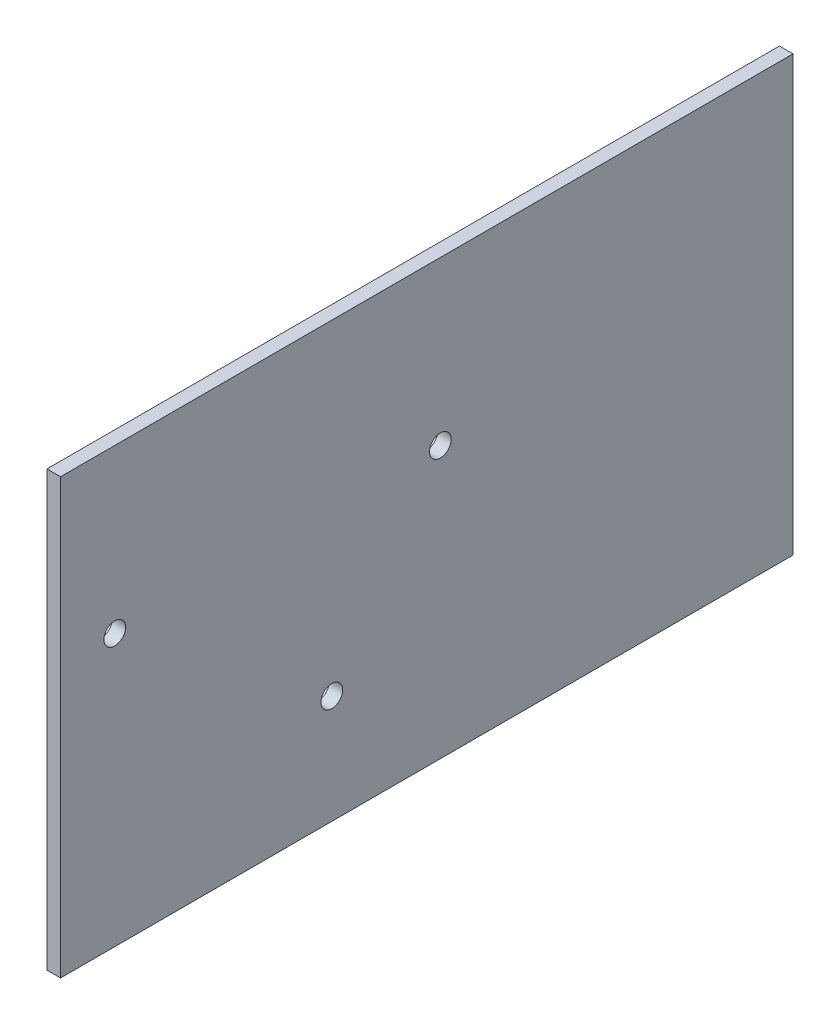
ISO-10303-21;
HEADER;
FILE_DESCRIPTION(('STEP AP214'),'2;1');
FILE_NAME('part.step','',(''),(''),'','','');
FILE_SCHEMA(('AUTOMOTIVE_DESIGN { 1 0 10303 214 1 1 1 1 }'));
ENDSEC;
DATA;
#1=APPLICATION_CONTEXT('core data for automotive mechanical design processes');
#2=APPLICATION_PROTOCOL_DEFINITION('international standard','automotive_design',2000,#1);
#3=PRODUCT_CONTEXT('',#1,'mechanical');
#4=PRODUCT('Part','Part','',(#3));
#5=PRODUCT_RELATED_PRODUCT_CATEGORY('part','',(#4));
#6=PRODUCT_DEFINITION_FORMATION('','',#4);
#7=PRODUCT_DEFINITION_CONTEXT('part definition',#1,'design');
#8=PRODUCT_DEFINITION('design','',#6,#7);
#9=PRODUCT_DEFINITION_SHAPE('','',#8);
#10=(LENGTH_UNIT() NAMED_UNIT(*) SI_UNIT(.MILLI.,.METRE.));
#11=(NAMED_UNIT(*) PLANE_ANGLE_UNIT() SI_UNIT($,.RADIAN.));
#12=(NAMED_UNIT(*) SI_UNIT($,.STERADIAN.) SOLID_ANGLE_UNIT());
#13=UNCERTAINTY_MEASURE_WITH_UNIT(LENGTH_MEASURE(1.E-05),#10,'distance_accuracy_value','');
#14=(GEOMETRIC_REPRESENTATION_CONTEXT(3) GLOBAL_UNCERTAINTY_ASSIGNED_CONTEXT((#13)) GLOBAL_UNIT_ASSIGNED_CONTEXT((#10,
#11,#12)) REPRESENTATION_CONTEXT('',''));
#15=CARTESIAN_POINT('',(0.,0.,0.));
#16=DIRECTION('',(0.,0.,1.));
#17=DIRECTION('',(1.,0.,0.));
#18=AXIS2_PLACEMENT_3D('',#15,#16,#17);
#19=CARTESIAN_POINT('',(-3.175,99.9099731913091,70.2838353243732));
#20=DIRECTION('',(0.,0.,1.));
#21=DIRECTION('',(0.,-1.,0.));
#22=AXIS2_PLACEMENT_3D('',#19,#20,#21);
#23=PLANE('',#22);
#24=DIRECTION('',(0.,-1.,0.));
#25=VECTOR('',#24,1.);
#26=CARTESIAN_POINT('',(0.,99.9099731913091,70.2838353243732));
#27=LINE('',#26,#25);
#28=CARTESIAN_POINT('',(0.,99.9099731913091,70.2838353243732));
#29=VERTEX_POINT('',#28);
#30=CARTESIAN_POINT('',(0.,-1.69002680869093,70.2838353243731));
#31=VERTEX_POINT('',#30);
#32=EDGE_CURVE('E98',#29,#31,#27,.T.);
#33=ORIENTED_EDGE('',*,*,#32,.F.);
#34=DIRECTION('',(1.,0.,0.));
#35=VECTOR('',#34,1.);
#36=CARTESIAN_POINT('',(-3.175,99.9099731913091,70.2838353243732));
#37=LINE('',#36,#35);
#38=CARTESIAN_POINT('',(-3.175,99.9099731913091,70.2838353243732));
#39=VERTEX_POINT('',#38);
#40=EDGE_CURVE('E11',#39,#29,#37,.T.);
#41=ORIENTED_EDGE('',*,*,#40,.F.);
#42=DIRECTION('',(0.,-1.,0.));
#43=VECTOR('',#42,1.);
#44=CARTESIAN_POINT('',(-3.175,99.9099731913091,70.2838353243732));
#45=LINE('',#44,#43);
#46=CARTESIAN_POINT('',(-3.175,-1.69002680869093,70.2838353243731));
#47=VERTEX_POINT('',#46);
#48=EDGE_CURVE('E91',#39,#47,#45,.T.);
#49=ORIENTED_EDGE('',*,*,#48,.T.);
#50=DIRECTION('',(1.,0.,0.));
#51=VECTOR('',#50,1.);
#52=CARTESIAN_POINT('',(-3.175,-1.69002680869093,70.2838353243731));
#53=LINE('',#52,#51);
#54=EDGE_CURVE('E36',#47,#31,#53,.T.);
#55=ORIENTED_EDGE('',*,*,#54,.T.);
#56=EDGE_LOOP('',(#33,#41,#49,#55));
#57=FACE_BOUND('',#56,.T.);
#58=ADVANCED_FACE('F33',(#57),#23,.T.);
#59=CARTESIAN_POINT('',(-3.175,99.9099731913091,70.2838353243732));
#60=DIRECTION('',(0.,1.,0.));
#61=DIRECTION('',(0.,0.,1.));
#62=AXIS2_PLACEMENT_3D('',#59,#60,#61);
#63=PLANE('',#62);
#64=DIRECTION('',(0.,0.,1.));
#65=VECTOR('',#64,1.);
#66=CARTESIAN_POINT('',(0.,99.9099731913091,70.2838353243732));
#67=LINE('',#66,#65);
#68=CARTESIAN_POINT('',(0.,99.9099731913091,-101.166164675627));
#69=VERTEX_POINT('',#68);
#70=EDGE_CURVE('E93',#69,#29,#67,.T.);
#71=ORIENTED_EDGE('',*,*,#70,.F.);
#72=DIRECTION('',(1.,0.,0.));
#73=VECTOR('',#72,1.);
#74=CARTESIAN_POINT('',(-3.175,99.9099731913091,-101.166164675627));
#75=LINE('',#74,#73);
#76=CARTESIAN_POINT('',(-3.175,99.9099731913091,-101.166164675627));
#77=VERTEX_POINT('',#76);
#78=EDGE_CURVE('E42',#77,#69,#75,.T.);
#79=ORIENTED_EDGE('',*,*,#78,.F.);
#80=DIRECTION('',(0.,0.,1.));
#81=VECTOR('',#80,1.);
#82=CARTESIAN_POINT('',(-3.175,99.9099731913091,70.2838353243732));
#83=LINE('',#82,#81);
#84=EDGE_CURVE('E88',#77,#39,#83,.T.);
#85=ORIENTED_EDGE('',*,*,#84,.T.);
#86=ORIENTED_EDGE('',*,*,#40,.T.);
#87=EDGE_LOOP('',(#71,#79,#85,#86));
#88=FACE_BOUND('',#87,.T.);
#89=ADVANCED_FACE('F109',(#88),#63,.T.);
#90=CARTESIAN_POINT('',(-3.175,99.9099731913091,-101.166164675627));
#91=DIRECTION('',(0.,0.,-1.));
#92=DIRECTION('',(0.,1.,0.));
#93=AXIS2_PLACEMENT_3D('',#90,#91,#92);
#94=PLANE('',#93);
#95=DIRECTION('',(0.,1.,0.));
#96=VECTOR('',#95,1.);
#97=CARTESIAN_POINT('',(0.,99.9099731913091,-101.166164675627));
#98=LINE('',#97,#96);
#99=CARTESIAN_POINT('',(0.,-1.69002680869093,-101.166164675627));
#100=VERTEX_POINT('',#99);
#101=EDGE_CURVE('E83',#100,#69,#98,.T.);
#102=ORIENTED_EDGE('',*,*,#101,.F.);
#103=DIRECTION('',(1.,0.,0.));
#104=VECTOR('',#103,1.);
#105=CARTESIAN_POINT('',(-3.175,-1.69002680869093,-101.166164675627));
#106=LINE('',#105,#104);
#107=CARTESIAN_POINT('',(-3.175,-1.69002680869093,-101.166164675627));
#108=VERTEX_POINT('',#107);
#109=EDGE_CURVE('E78',#108,#100,#106,.T.);
#110=ORIENTED_EDGE('',*,*,#109,.F.);
#111=DIRECTION('',(0.,1.,0.));
#112=VECTOR('',#111,1.);
#113=CARTESIAN_POINT('',(-3.175,99.9099731913091,-101.166164675627));
#114=LINE('',#113,#112);
#115=EDGE_CURVE('E81',#108,#77,#114,.T.);
#116=ORIENTED_EDGE('',*,*,#115,.T.);
#117=ORIENTED_EDGE('',*,*,#78,.T.);
#118=EDGE_LOOP('',(#102,#110,#116,#117));
#119=FACE_BOUND('',#118,.T.);
#120=ADVANCED_FACE('F80',(#119),#94,.T.);
#121=CARTESIAN_POINT('',(-3.175,-1.69002680869093,70.2838353243731));
#122=DIRECTION('',(0.,-1.,0.));
#123=DIRECTION('',(0.,0.,-1.));
#124=AXIS2_PLACEMENT_3D('',#121,#122,#123);
#125=PLANE('',#124);
#126=DIRECTION('',(0.,0.,-1.));
#127=VECTOR('',#126,1.);
#128=CARTESIAN_POINT('',(0.,-1.69002680869093,70.2838353243731));
#129=LINE('',#128,#127);
#130=EDGE_CURVE('E101',#31,#100,#129,.T.);
#131=ORIENTED_EDGE('',*,*,#130,.F.);
#132=ORIENTED_EDGE('',*,*,#54,.F.);
#133=DIRECTION('',(0.,0.,-1.));
#134=VECTOR('',#133,1.);
#135=CARTESIAN_POINT('',(-3.175,-1.69002680869093,70.2838353243731));
#136=LINE('',#135,#134);
#137=EDGE_CURVE('E87',#47,#108,#136,.T.);
#138=ORIENTED_EDGE('',*,*,#137,.T.);
#139=ORIENTED_EDGE('',*,*,#109,.T.);
#140=EDGE_LOOP('',(#131,#132,#138,#139));
#141=FACE_BOUND('',#140,.T.);
#142=ADVANCED_FACE('F90',(#141),#125,.T.);
#143=CARTESIAN_POINT('',(-3.175,-1.69002680869093,70.2838353243731));
#144=DIRECTION('',(1.,0.,0.));
#145=DIRECTION('',(0.,0.,-1.));
#146=AXIS2_PLACEMENT_3D('',#143,#144,#145);
#147=PLANE('',#146);
#148=CARTESIAN_POINT('',(-3.175,23.7099731913091,6.78383532437313));
#149=DIRECTION('',(1.,0.,0.));
#150=DIRECTION('',(0.,0.,-1.));
#151=AXIS2_PLACEMENT_3D('',#148,#149,#150);
#152=CIRCLE('',#151,2.54);
#153=CARTESIAN_POINT('',(-3.175,23.7099731913091,4.24383532437313));
#154=VERTEX_POINT('',#153);
#155=EDGE_CURVE('E146',#154,#154,#152,.T.);
#156=ORIENTED_EDGE('',*,*,#155,.T.);
#157=EDGE_LOOP('',(#156));
#158=FACE_BOUND('',#157,.T.);
#159=CARTESIAN_POINT('',(-3.175,61.8099731913091,-18.6161646756268));
#160=DIRECTION('',(1.,0.,0.));
#161=DIRECTION('',(0.,0.,-1.));
#162=AXIS2_PLACEMENT_3D('',#159,#160,#161);
#163=CIRCLE('',#162,2.54);
#164=CARTESIAN_POINT('',(-3.175,61.8099731913091,-21.1561646756268));
#165=VERTEX_POINT('',#164);
#166=EDGE_CURVE('E154',#165,#165,#163,.T.);
#167=ORIENTED_EDGE('',*,*,#166,.T.);
#168=EDGE_LOOP('',(#167));
#169=FACE_BOUND('',#168,.T.);
#170=CARTESIAN_POINT('',(-3.175,61.8099731913091,57.5838353243732));
#171=DIRECTION('',(1.,0.,0.));
#172=DIRECTION('',(0.,0.,-1.));
#173=AXIS2_PLACEMENT_3D('',#170,#171,#172);
#174=CIRCLE('',#173,2.54);
#175=CARTESIAN_POINT('',(-3.175,61.8099731913091,55.0438353243732));
#176=VERTEX_POINT('',#175);
#177=EDGE_CURVE('E102',#176,#176,#174,.T.);
#178=ORIENTED_EDGE('',*,*,#177,.T.);
#179=EDGE_LOOP('',(#178));
#180=FACE_BOUND('',#179,.T.);
#181=ORIENTED_EDGE('',*,*,#48,.F.);
#182=ORIENTED_EDGE('',*,*,#84,.F.);
#183=ORIENTED_EDGE('',*,*,#115,.F.);
#184=ORIENTED_EDGE('',*,*,#137,.F.);
#185=EDGE_LOOP('',(#181,#182,#183,#184));
#186=FACE_BOUND('',#185,.T.);
#187=ADVANCED_FACE('F86',(#158,#169,#180,#186),#147,.F.);
#188=CARTESIAN_POINT('',(0.,-1.69002680869093,70.2838353243731));
#189=DIRECTION('',(1.,0.,0.));
#190=DIRECTION('',(0.,0.,-1.));
#191=AXIS2_PLACEMENT_3D('',#188,#189,#190);
#192=PLANE('',#191);
#193=CARTESIAN_POINT('',(0.,23.7099731913091,6.78383532437313));
#194=DIRECTION('',(1.,0.,0.));
#195=DIRECTION('',(0.,0.,-1.));
#196=AXIS2_PLACEMENT_3D('',#193,#194,#195);
#197=CIRCLE('',#196,2.54);
#198=CARTESIAN_POINT('',(0.,23.7099731913091,4.24383532437313));
#199=VERTEX_POINT('',#198);
#200=EDGE_CURVE('E149',#199,#199,#197,.T.);
#201=ORIENTED_EDGE('',*,*,#200,.F.);
#202=EDGE_LOOP('',(#201));
#203=FACE_BOUND('',#202,.T.);
#204=CARTESIAN_POINT('',(0.,61.8099731913091,-18.6161646756268));
#205=DIRECTION('',(1.,0.,0.));
#206=DIRECTION('',(0.,0.,-1.));
#207=AXIS2_PLACEMENT_3D('',#204,#205,#206);
#208=CIRCLE('',#207,2.54);
#209=CARTESIAN_POINT('',(0.,61.8099731913091,-21.1561646756268));
#210=VERTEX_POINT('',#209);
#211=EDGE_CURVE('E151',#210,#210,#208,.T.);
#212=ORIENTED_EDGE('',*,*,#211,.F.);
#213=EDGE_LOOP('',(#212));
#214=FACE_BOUND('',#213,.T.);
#215=CARTESIAN_POINT('',(0.,61.8099731913091,57.5838353243732));
#216=DIRECTION('',(1.,0.,0.));
#217=DIRECTION('',(0.,0.,-1.));
#218=AXIS2_PLACEMENT_3D('',#215,#216,#217);
#219=CIRCLE('',#218,2.54);
#220=CARTESIAN_POINT('',(0.,61.8099731913091,55.0438353243732));
#221=VERTEX_POINT('',#220);
#222=EDGE_CURVE('E157',#221,#221,#219,.T.);
#223=ORIENTED_EDGE('',*,*,#222,.F.);
#224=EDGE_LOOP('',(#223));
#225=FACE_BOUND('',#224,.T.);
#226=ORIENTED_EDGE('',*,*,#32,.T.);
#227=ORIENTED_EDGE('',*,*,#130,.T.);
#228=ORIENTED_EDGE('',*,*,#101,.T.);
#229=ORIENTED_EDGE('',*,*,#70,.T.);
#230=EDGE_LOOP('',(#226,#227,#228,#229));
#231=FACE_BOUND('',#230,.T.);
#232=ADVANCED_FACE('F108',(#203,#214,#225,#231),#192,.T.);
#233=CARTESIAN_POINT('',(-3.175,61.8099731913091,57.5838353243732));
#234=DIRECTION('',(1.,0.,0.));
#235=DIRECTION('',(0.,0.,-1.));
#236=AXIS2_PLACEMENT_3D('',#233,#234,#235);
#237=CYLINDRICAL_SURFACE('',#236,2.54);
#238=ORIENTED_EDGE('',*,*,#177,.F.);
#239=EDGE_LOOP('',(#238));
#240=FACE_BOUND('',#239,.T.);
#241=ORIENTED_EDGE('',*,*,#222,.T.);
#242=EDGE_LOOP('',(#241));
#243=FACE_BOUND('',#242,.T.);
#244=ADVANCED_FACE('F127',(#240,#243),#237,.F.);
#245=CARTESIAN_POINT('',(-3.175,61.8099731913091,-18.6161646756268));
#246=DIRECTION('',(1.,0.,0.));
#247=DIRECTION('',(0.,0.,-1.));
#248=AXIS2_PLACEMENT_3D('',#245,#246,#247);
#249=CYLINDRICAL_SURFACE('',#248,2.54);
#250=ORIENTED_EDGE('',*,*,#166,.F.);
#251=EDGE_LOOP('',(#250));
#252=FACE_BOUND('',#251,.T.);
#253=ORIENTED_EDGE('',*,*,#211,.T.);
#254=EDGE_LOOP('',(#253));
#255=FACE_BOUND('',#254,.T.);
#256=ADVANCED_FACE('F134',(#252,#255),#249,.F.);
#257=CARTESIAN_POINT('',(-3.175,23.7099731913091,6.78383532437313));
#258=DIRECTION('',(1.,0.,0.));
#259=DIRECTION('',(0.,0.,-1.));
#260=AXIS2_PLACEMENT_3D('',#257,#258,#259);
#261=CYLINDRICAL_SURFACE('',#260,2.54);
#262=ORIENTED_EDGE('',*,*,#155,.F.);
#263=EDGE_LOOP('',(#262));
#264=FACE_BOUND('',#263,.T.);
#265=ORIENTED_EDGE('',*,*,#200,.T.);
#266=EDGE_LOOP('',(#265));
#267=FACE_BOUND('',#266,.T.);
#268=ADVANCED_FACE('F138',(#264,#267),#261,.F.);
#269=CLOSED_SHELL('',(#58,#89,#120,#142,#187,#232,#244,#256,#268));
#270=MANIFOLD_SOLID_BREP('B2',#269);
#271=ADVANCED_BREP_SHAPE_REPRESENTATION('',(#18,#270),#14);
#272=SHAPE_DEFINITION_REPRESENTATION(#9,#271);
ENDSEC;
END-ISO-10303-21;
